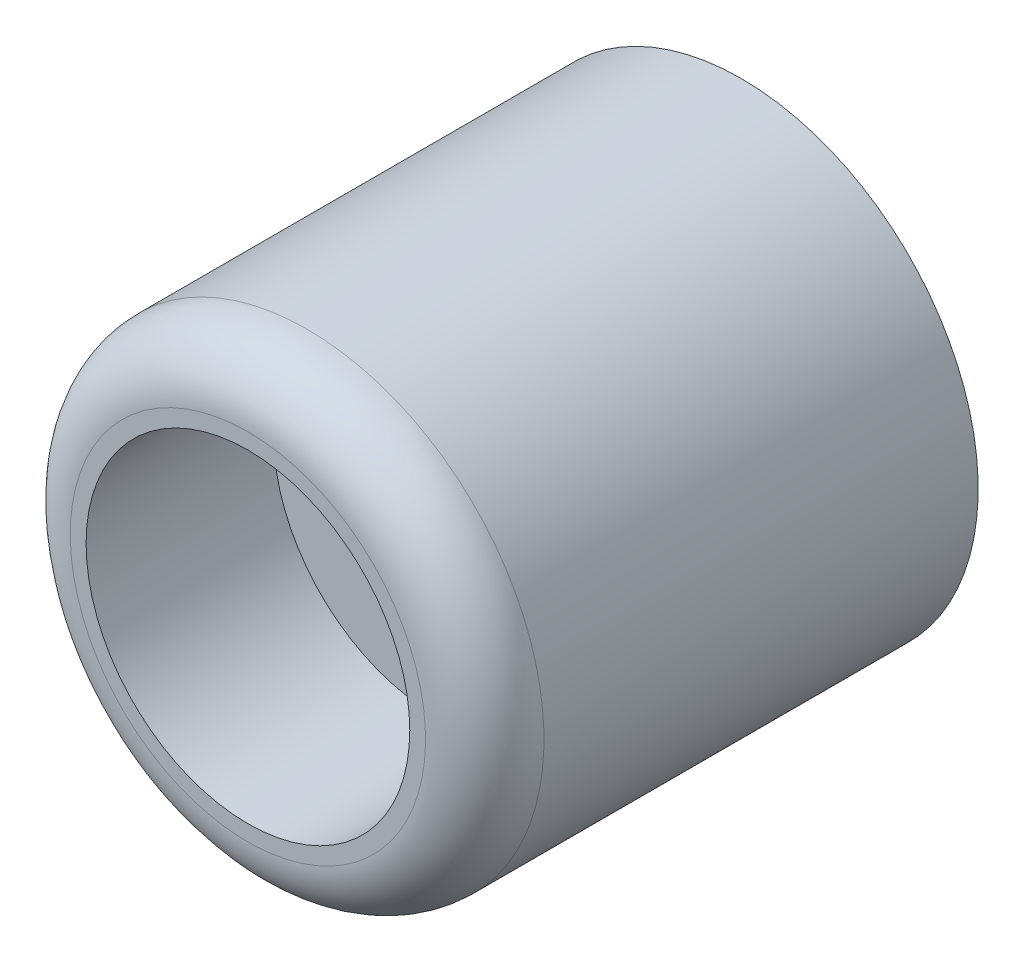
ISO-10303-21;
HEADER;
FILE_DESCRIPTION(('STEP AP214'),'2;1');
FILE_NAME('part.step','',(''),(''),'','','');
FILE_SCHEMA(('AUTOMOTIVE_DESIGN { 1 0 10303 214 1 1 1 1 }'));
ENDSEC;
DATA;
#1=APPLICATION_CONTEXT('core data for automotive mechanical design processes');
#2=APPLICATION_PROTOCOL_DEFINITION('international standard','automotive_design',2000,#1);
#3=PRODUCT_CONTEXT('',#1,'mechanical');
#4=PRODUCT('Part','Part','',(#3));
#5=PRODUCT_RELATED_PRODUCT_CATEGORY('part','',(#4));
#6=PRODUCT_DEFINITION_FORMATION('','',#4);
#7=PRODUCT_DEFINITION_CONTEXT('part definition',#1,'design');
#8=PRODUCT_DEFINITION('design','',#6,#7);
#9=PRODUCT_DEFINITION_SHAPE('','',#8);
#10=(LENGTH_UNIT() NAMED_UNIT(*) SI_UNIT(.MILLI.,.METRE.));
#11=(NAMED_UNIT(*) PLANE_ANGLE_UNIT() SI_UNIT($,.RADIAN.));
#12=(NAMED_UNIT(*) SI_UNIT($,.STERADIAN.) SOLID_ANGLE_UNIT());
#13=UNCERTAINTY_MEASURE_WITH_UNIT(LENGTH_MEASURE(1.E-05),#10,'distance_accuracy_value','');
#14=(GEOMETRIC_REPRESENTATION_CONTEXT(3) GLOBAL_UNCERTAINTY_ASSIGNED_CONTEXT((#13)) GLOBAL_UNIT_ASSIGNED_CONTEXT((#10,
#11,#12)) REPRESENTATION_CONTEXT('',''));
#15=CARTESIAN_POINT('',(0.,0.,0.));
#16=DIRECTION('',(0.,0.,1.));
#17=DIRECTION('',(1.,0.,0.));
#18=AXIS2_PLACEMENT_3D('',#15,#16,#17);
#19=CARTESIAN_POINT('',(0.,0.,2.3368));
#20=DIRECTION('',(0.,0.,-1.));
#21=DIRECTION('',(0.,1.,0.));
#22=AXIS2_PLACEMENT_3D('',#19,#20,#21);
#23=CONICAL_SURFACE('',#22,2.4257,0.78539816339745);
#24=CARTESIAN_POINT('',(0.,0.,0.));
#25=DIRECTION('',(0.,0.,-1.));
#26=DIRECTION('',(0.,1.,0.));
#27=AXIS2_PLACEMENT_3D('',#24,#25,#26);
#28=CIRCLE('',#27,4.76250000000001);
#29=CARTESIAN_POINT('',(0.,4.76250000000001,0.));
#30=VERTEX_POINT('',#29);
#31=EDGE_CURVE('E10',#30,#30,#28,.T.);
#32=ORIENTED_EDGE('',*,*,#31,.T.);
#33=EDGE_LOOP('',(#32));
#34=FACE_BOUND('',#33,.T.);
#35=CARTESIAN_POINT('',(0.,0.,2.3368));
#36=DIRECTION('',(0.,0.,-1.));
#37=DIRECTION('',(0.,1.,0.));
#38=AXIS2_PLACEMENT_3D('',#35,#36,#37);
#39=CIRCLE('',#38,2.4257);
#40=CARTESIAN_POINT('',(0.,2.4257,2.3368));
#41=VERTEX_POINT('',#40);
#42=EDGE_CURVE('E62',#41,#41,#39,.T.);
#43=ORIENTED_EDGE('',*,*,#42,.F.);
#44=EDGE_LOOP('',(#43));
#45=FACE_BOUND('',#44,.T.);
#46=ADVANCED_FACE('F34',(#34,#45),#23,.F.);
#47=CARTESIAN_POINT('',(0.,4.76250000000001,0.));
#48=DIRECTION('',(0.,0.,-1.));
#49=DIRECTION('',(0.,1.,0.));
#50=AXIS2_PLACEMENT_3D('',#47,#48,#49);
#51=PLANE('',#50);
#52=CARTESIAN_POINT('',(0.,0.,0.));
#53=DIRECTION('',(0.,0.,-1.));
#54=DIRECTION('',(0.,1.,0.));
#55=AXIS2_PLACEMENT_3D('',#52,#53,#54);
#56=CIRCLE('',#55,6.096);
#57=CARTESIAN_POINT('',(0.,6.096,0.));
#58=VERTEX_POINT('',#57);
#59=EDGE_CURVE('E40',#58,#58,#56,.T.);
#60=ORIENTED_EDGE('',*,*,#59,.T.);
#61=EDGE_LOOP('',(#60));
#62=FACE_BOUND('',#61,.T.);
#63=ORIENTED_EDGE('',*,*,#31,.F.);
#64=EDGE_LOOP('',(#63));
#65=FACE_BOUND('',#64,.T.);
#66=ADVANCED_FACE('F70',(#62,#65),#51,.T.);
#67=CARTESIAN_POINT('',(0.,0.,12.7));
#68=DIRECTION('',(0.,0.,-1.));
#69=DIRECTION('',(0.,1.,0.));
#70=AXIS2_PLACEMENT_3D('',#67,#68,#69);
#71=CYLINDRICAL_SURFACE('',#70,6.096);
#72=CARTESIAN_POINT('',(0.,0.,11.176));
#73=DIRECTION('',(0.,0.,-1.));
#74=DIRECTION('',(0.,1.,0.));
#75=AXIS2_PLACEMENT_3D('',#72,#73,#74);
#76=CIRCLE('',#75,6.096);
#77=CARTESIAN_POINT('',(0.,6.096,11.176));
#78=VERTEX_POINT('',#77);
#79=EDGE_CURVE('E44',#78,#78,#76,.T.);
#80=ORIENTED_EDGE('',*,*,#79,.T.);
#81=EDGE_LOOP('',(#80));
#82=FACE_BOUND('',#81,.T.);
#83=ORIENTED_EDGE('',*,*,#59,.F.);
#84=EDGE_LOOP('',(#83));
#85=FACE_BOUND('',#84,.T.);
#86=ADVANCED_FACE('F74',(#82,#85),#71,.T.);
#87=CARTESIAN_POINT('',(0.,0.,11.176));
#88=DIRECTION('',(0.,0.,-1.));
#89=DIRECTION('',(0.,1.,0.));
#90=AXIS2_PLACEMENT_3D('',#87,#88,#89);
#91=TOROIDAL_SURFACE('',#90,4.572,1.524);
#92=CARTESIAN_POINT('',(0.,0.,12.7));
#93=DIRECTION('',(0.,0.,-1.));
#94=DIRECTION('',(0.,1.,0.));
#95=AXIS2_PLACEMENT_3D('',#92,#93,#94);
#96=CIRCLE('',#95,4.572);
#97=CARTESIAN_POINT('',(0.,4.572,12.7));
#98=VERTEX_POINT('',#97);
#99=EDGE_CURVE('E48',#98,#98,#96,.T.);
#100=ORIENTED_EDGE('',*,*,#99,.T.);
#101=EDGE_LOOP('',(#100));
#102=FACE_BOUND('',#101,.T.);
#103=ORIENTED_EDGE('',*,*,#79,.F.);
#104=EDGE_LOOP('',(#103));
#105=FACE_BOUND('',#104,.T.);
#106=ADVANCED_FACE('F78',(#102,#105),#91,.T.);
#107=CARTESIAN_POINT('',(0.,4.572,12.7));
#108=DIRECTION('',(0.,0.,1.));
#109=DIRECTION('',(0.,-1.,0.));
#110=AXIS2_PLACEMENT_3D('',#107,#108,#109);
#111=PLANE('',#110);
#112=CARTESIAN_POINT('',(0.,0.,12.7));
#113=DIRECTION('',(0.,0.,-1.));
#114=DIRECTION('',(0.,1.,0.));
#115=AXIS2_PLACEMENT_3D('',#112,#113,#114);
#116=CIRCLE('',#115,4.1656);
#117=CARTESIAN_POINT('',(0.,4.1656,12.7));
#118=VERTEX_POINT('',#117);
#119=EDGE_CURVE('E53',#118,#118,#116,.T.);
#120=ORIENTED_EDGE('',*,*,#119,.T.);
#121=EDGE_LOOP('',(#120));
#122=FACE_BOUND('',#121,.T.);
#123=ORIENTED_EDGE('',*,*,#99,.F.);
#124=EDGE_LOOP('',(#123));
#125=FACE_BOUND('',#124,.T.);
#126=ADVANCED_FACE('F85',(#122,#125),#111,.T.);
#127=CARTESIAN_POINT('',(0.,0.,12.7));
#128=DIRECTION('',(0.,0.,-1.));
#129=DIRECTION('',(0.,1.,0.));
#130=AXIS2_PLACEMENT_3D('',#127,#128,#129);
#131=CYLINDRICAL_SURFACE('',#130,4.1656);
#132=CARTESIAN_POINT('',(0.,0.,7.874));
#133=DIRECTION('',(0.,0.,-1.));
#134=DIRECTION('',(0.,1.,0.));
#135=AXIS2_PLACEMENT_3D('',#132,#133,#134);
#136=CIRCLE('',#135,4.1656);
#137=CARTESIAN_POINT('',(0.,4.1656,7.874));
#138=VERTEX_POINT('',#137);
#139=EDGE_CURVE('E56',#138,#138,#136,.T.);
#140=ORIENTED_EDGE('',*,*,#139,.T.);
#141=EDGE_LOOP('',(#140));
#142=FACE_BOUND('',#141,.T.);
#143=ORIENTED_EDGE('',*,*,#119,.F.);
#144=EDGE_LOOP('',(#143));
#145=FACE_BOUND('',#144,.T.);
#146=ADVANCED_FACE('F89',(#142,#145),#131,.F.);
#147=CARTESIAN_POINT('',(0.,2.4257,7.874));
#148=DIRECTION('',(0.,0.,1.));
#149=DIRECTION('',(0.,-1.,0.));
#150=AXIS2_PLACEMENT_3D('',#147,#148,#149);
#151=PLANE('',#150);
#152=CARTESIAN_POINT('',(0.,0.,7.874));
#153=DIRECTION('',(0.,0.,-1.));
#154=DIRECTION('',(0.,1.,0.));
#155=AXIS2_PLACEMENT_3D('',#152,#153,#154);
#156=CIRCLE('',#155,2.4257);
#157=CARTESIAN_POINT('',(0.,2.4257,7.874));
#158=VERTEX_POINT('',#157);
#159=EDGE_CURVE('E59',#158,#158,#156,.T.);
#160=ORIENTED_EDGE('',*,*,#159,.T.);
#161=EDGE_LOOP('',(#160));
#162=FACE_BOUND('',#161,.T.);
#163=ORIENTED_EDGE('',*,*,#139,.F.);
#164=EDGE_LOOP('',(#163));
#165=FACE_BOUND('',#164,.T.);
#166=ADVANCED_FACE('F93',(#162,#165),#151,.T.);
#167=CARTESIAN_POINT('',(0.,0.,12.7));
#168=DIRECTION('',(0.,0.,-1.));
#169=DIRECTION('',(0.,1.,0.));
#170=AXIS2_PLACEMENT_3D('',#167,#168,#169);
#171=CYLINDRICAL_SURFACE('',#170,2.4257);
#172=ORIENTED_EDGE('',*,*,#42,.T.);
#173=EDGE_LOOP('',(#172));
#174=FACE_BOUND('',#173,.T.);
#175=ORIENTED_EDGE('',*,*,#159,.F.);
#176=EDGE_LOOP('',(#175));
#177=FACE_BOUND('',#176,.T.);
#178=ADVANCED_FACE('F66',(#174,#177),#171,.F.);
#179=CLOSED_SHELL('',(#46,#66,#86,#106,#126,#146,#166,#178));
#180=MANIFOLD_SOLID_BREP('B2',#179);
#181=ADVANCED_BREP_SHAPE_REPRESENTATION('',(#18,#180),#14);
#182=SHAPE_DEFINITION_REPRESENTATION(#9,#181);
ENDSEC;
END-ISO-10303-21;
